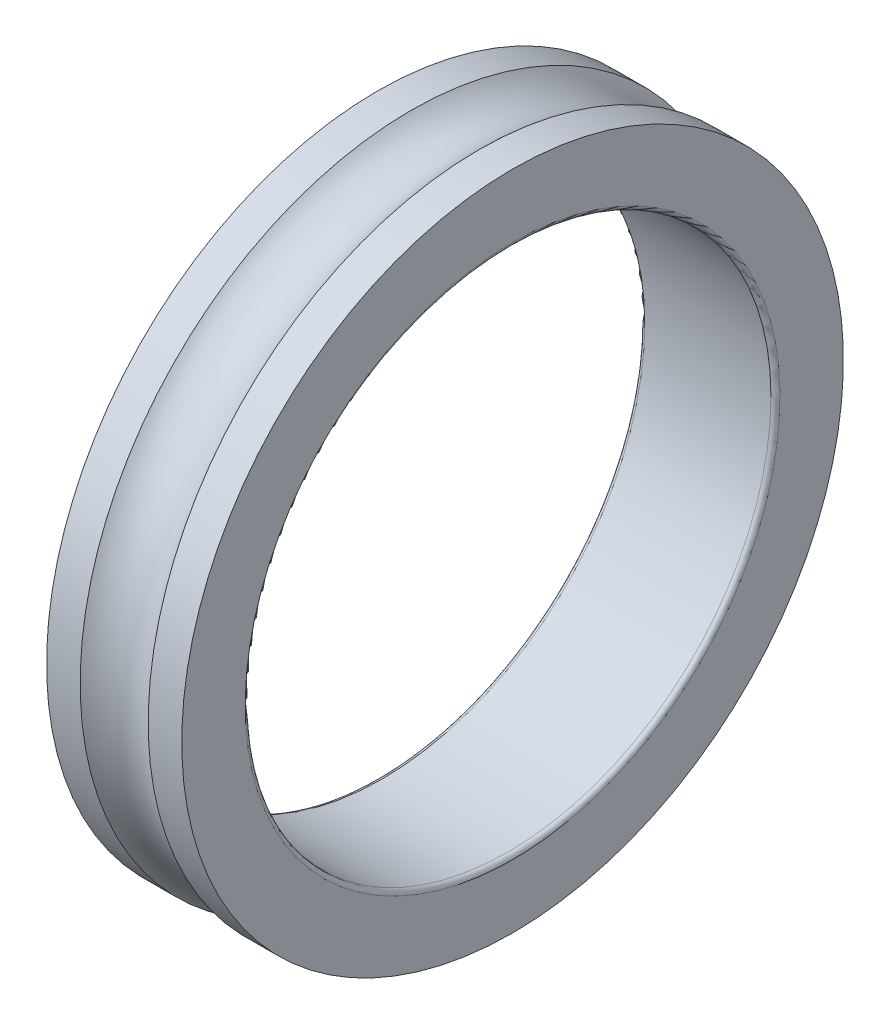
ISO-10303-21;
HEADER;
FILE_DESCRIPTION(('STEP AP214'),'2;1');
FILE_NAME('part.step','',(''),(''),'','','');
FILE_SCHEMA(('AUTOMOTIVE_DESIGN { 1 0 10303 214 1 1 1 1 }'));
ENDSEC;
DATA;
#1=APPLICATION_CONTEXT('core data for automotive mechanical design processes');
#2=APPLICATION_PROTOCOL_DEFINITION('international standard','automotive_design',2000,#1);
#3=PRODUCT_CONTEXT('',#1,'mechanical');
#4=PRODUCT('Part','Part','',(#3));
#5=PRODUCT_RELATED_PRODUCT_CATEGORY('part','',(#4));
#6=PRODUCT_DEFINITION_FORMATION('','',#4);
#7=PRODUCT_DEFINITION_CONTEXT('part definition',#1,'design');
#8=PRODUCT_DEFINITION('design','',#6,#7);
#9=PRODUCT_DEFINITION_SHAPE('','',#8);
#10=(LENGTH_UNIT() NAMED_UNIT(*) SI_UNIT(.MILLI.,.METRE.));
#11=(NAMED_UNIT(*) PLANE_ANGLE_UNIT() SI_UNIT($,.RADIAN.));
#12=(NAMED_UNIT(*) SI_UNIT($,.STERADIAN.) SOLID_ANGLE_UNIT());
#13=UNCERTAINTY_MEASURE_WITH_UNIT(LENGTH_MEASURE(1.E-05),#10,'distance_accuracy_value','');
#14=(GEOMETRIC_REPRESENTATION_CONTEXT(3) GLOBAL_UNCERTAINTY_ASSIGNED_CONTEXT((#13)) GLOBAL_UNIT_ASSIGNED_CONTEXT((#10,
#11,#12)) REPRESENTATION_CONTEXT('',''));
#15=CARTESIAN_POINT('',(0.,0.,0.));
#16=DIRECTION('',(0.,0.,1.));
#17=DIRECTION('',(1.,0.,0.));
#18=AXIS2_PLACEMENT_3D('',#15,#16,#17);
#19=CARTESIAN_POINT('',(7.88247516529061,0.,0.));
#20=DIRECTION('',(-1.,0.,0.));
#21=DIRECTION('',(0.,1.,0.));
#22=AXIS2_PLACEMENT_3D('',#19,#20,#21);
#23=CYLINDRICAL_SURFACE('',#22,22.025);
#24=CARTESIAN_POINT('',(6.76495033058121,0.,0.));
#25=DIRECTION('',(1.,0.,0.));
#26=DIRECTION('',(0.,1.,0.));
#27=AXIS2_PLACEMENT_3D('',#24,#25,#26);
#28=CIRCLE('',#27,22.025);
#29=CARTESIAN_POINT('',(6.76495033058121,22.025,0.));
#30=VERTEX_POINT('',#29);
#31=EDGE_CURVE('E11',#30,#30,#28,.T.);
#32=ORIENTED_EDGE('',*,*,#31,.T.);
#33=EDGE_LOOP('',(#32));
#34=FACE_BOUND('',#33,.T.);
#35=CARTESIAN_POINT('',(9.,0.,0.));
#36=DIRECTION('',(1.,0.,0.));
#37=DIRECTION('',(0.,1.,0.));
#38=AXIS2_PLACEMENT_3D('',#35,#36,#37);
#39=CIRCLE('',#38,22.025);
#40=CARTESIAN_POINT('',(9.,22.025,0.));
#41=VERTEX_POINT('',#40);
#42=EDGE_CURVE('E61',#41,#41,#39,.T.);
#43=ORIENTED_EDGE('',*,*,#42,.F.);
#44=EDGE_LOOP('',(#43));
#45=FACE_BOUND('',#44,.T.);
#46=ADVANCED_FACE('F16',(#34,#45),#23,.T.);
#47=CARTESIAN_POINT('',(4.5,0.,0.));
#48=DIRECTION('',(1.,0.,0.));
#49=DIRECTION('',(0.,0.,-1.));
#50=AXIS2_PLACEMENT_3D('',#47,#48,#49);
#51=TOROIDAL_SURFACE('',#50,24.25,3.175);
#52=CARTESIAN_POINT('',(2.23504966941878,0.,0.));
#53=DIRECTION('',(1.,0.,0.));
#54=DIRECTION('',(0.,1.,0.));
#55=AXIS2_PLACEMENT_3D('',#52,#53,#54);
#56=CIRCLE('',#55,22.025);
#57=CARTESIAN_POINT('',(2.23504966941878,22.025,0.));
#58=VERTEX_POINT('',#57);
#59=EDGE_CURVE('E25',#58,#58,#56,.T.);
#60=ORIENTED_EDGE('',*,*,#59,.T.);
#61=EDGE_LOOP('',(#60));
#62=FACE_BOUND('',#61,.T.);
#63=ORIENTED_EDGE('',*,*,#31,.F.);
#64=EDGE_LOOP('',(#63));
#65=FACE_BOUND('',#64,.T.);
#66=ADVANCED_FACE('F18',(#62,#65),#51,.F.);
#67=CARTESIAN_POINT('',(1.11752483470939,0.,0.));
#68=DIRECTION('',(-1.,0.,0.));
#69=DIRECTION('',(0.,1.,0.));
#70=AXIS2_PLACEMENT_3D('',#67,#68,#69);
#71=CYLINDRICAL_SURFACE('',#70,22.025);
#72=CARTESIAN_POINT('',(0.,0.,0.));
#73=DIRECTION('',(1.,0.,0.));
#74=DIRECTION('',(0.,1.,0.));
#75=AXIS2_PLACEMENT_3D('',#72,#73,#74);
#76=CIRCLE('',#75,22.025);
#77=CARTESIAN_POINT('',(0.,22.025,0.));
#78=VERTEX_POINT('',#77);
#79=EDGE_CURVE('E69',#78,#78,#76,.T.);
#80=ORIENTED_EDGE('',*,*,#79,.T.);
#81=EDGE_LOOP('',(#80));
#82=FACE_BOUND('',#81,.T.);
#83=ORIENTED_EDGE('',*,*,#59,.F.);
#84=EDGE_LOOP('',(#83));
#85=FACE_BOUND('',#84,.T.);
#86=ADVANCED_FACE('F74',(#82,#85),#71,.T.);
#87=CARTESIAN_POINT('',(0.,19.9125,0.));
#88=DIRECTION('',(-1.,0.,0.));
#89=DIRECTION('',(0.,-1.,0.));
#90=AXIS2_PLACEMENT_3D('',#87,#88,#89);
#91=PLANE('',#90);
#92=CARTESIAN_POINT('',(0.,0.,0.));
#93=DIRECTION('',(1.,0.,0.));
#94=DIRECTION('',(0.,1.,0.));
#95=AXIS2_PLACEMENT_3D('',#92,#93,#94);
#96=CIRCLE('',#95,17.8);
#97=CARTESIAN_POINT('',(0.,17.8,0.));
#98=VERTEX_POINT('',#97);
#99=EDGE_CURVE('E50',#98,#98,#96,.T.);
#100=ORIENTED_EDGE('',*,*,#99,.T.);
#101=EDGE_LOOP('',(#100));
#102=FACE_BOUND('',#101,.T.);
#103=ORIENTED_EDGE('',*,*,#79,.F.);
#104=EDGE_LOOP('',(#103));
#105=FACE_BOUND('',#104,.T.);
#106=ADVANCED_FACE('F77',(#102,#105),#91,.T.);
#107=CARTESIAN_POINT('',(0.3,0.,0.));
#108=DIRECTION('',(1.,0.,0.));
#109=DIRECTION('',(0.,0.,-1.));
#110=AXIS2_PLACEMENT_3D('',#107,#108,#109);
#111=TOROIDAL_SURFACE('',#110,17.8,0.3);
#112=CARTESIAN_POINT('',(0.3,0.,0.));
#113=DIRECTION('',(1.,0.,0.));
#114=DIRECTION('',(0.,1.,0.));
#115=AXIS2_PLACEMENT_3D('',#112,#113,#114);
#116=CIRCLE('',#115,17.5);
#117=CARTESIAN_POINT('',(0.3,17.5,0.));
#118=VERTEX_POINT('',#117);
#119=EDGE_CURVE('E54',#118,#118,#116,.T.);
#120=ORIENTED_EDGE('',*,*,#119,.T.);
#121=EDGE_LOOP('',(#120));
#122=FACE_BOUND('',#121,.T.);
#123=ORIENTED_EDGE('',*,*,#99,.F.);
#124=EDGE_LOOP('',(#123));
#125=FACE_BOUND('',#124,.T.);
#126=ADVANCED_FACE('F79',(#122,#125),#111,.T.);
#127=CARTESIAN_POINT('',(4.5,0.,0.));
#128=DIRECTION('',(-1.,0.,0.));
#129=DIRECTION('',(0.,1.,0.));
#130=AXIS2_PLACEMENT_3D('',#127,#128,#129);
#131=CYLINDRICAL_SURFACE('',#130,17.5);
#132=CARTESIAN_POINT('',(8.7,0.,0.));
#133=DIRECTION('',(1.,0.,0.));
#134=DIRECTION('',(0.,1.,0.));
#135=AXIS2_PLACEMENT_3D('',#132,#133,#134);
#136=CIRCLE('',#135,17.5);
#137=CARTESIAN_POINT('',(8.7,17.5,0.));
#138=VERTEX_POINT('',#137);
#139=EDGE_CURVE('E20',#138,#138,#136,.T.);
#140=ORIENTED_EDGE('',*,*,#139,.T.);
#141=EDGE_LOOP('',(#140));
#142=FACE_BOUND('',#141,.T.);
#143=ORIENTED_EDGE('',*,*,#119,.F.);
#144=EDGE_LOOP('',(#143));
#145=FACE_BOUND('',#144,.T.);
#146=ADVANCED_FACE('F58',(#142,#145),#131,.F.);
#147=CARTESIAN_POINT('',(8.7,0.,0.));
#148=DIRECTION('',(1.,0.,0.));
#149=DIRECTION('',(0.,0.,-1.));
#150=AXIS2_PLACEMENT_3D('',#147,#148,#149);
#151=TOROIDAL_SURFACE('',#150,17.8,0.3);
#152=CARTESIAN_POINT('',(9.,0.,0.));
#153=DIRECTION('',(1.,0.,0.));
#154=DIRECTION('',(0.,1.,0.));
#155=AXIS2_PLACEMENT_3D('',#152,#153,#154);
#156=CIRCLE('',#155,17.8);
#157=CARTESIAN_POINT('',(9.,17.8,0.));
#158=VERTEX_POINT('',#157);
#159=EDGE_CURVE('E63',#158,#158,#156,.T.);
#160=ORIENTED_EDGE('',*,*,#159,.T.);
#161=EDGE_LOOP('',(#160));
#162=FACE_BOUND('',#161,.T.);
#163=ORIENTED_EDGE('',*,*,#139,.F.);
#164=EDGE_LOOP('',(#163));
#165=FACE_BOUND('',#164,.T.);
#166=ADVANCED_FACE('F97',(#162,#165),#151,.T.);
#167=CARTESIAN_POINT('',(9.,19.9125,0.));
#168=DIRECTION('',(1.,0.,0.));
#169=DIRECTION('',(0.,1.,0.));
#170=AXIS2_PLACEMENT_3D('',#167,#168,#169);
#171=PLANE('',#170);
#172=ORIENTED_EDGE('',*,*,#42,.T.);
#173=EDGE_LOOP('',(#172));
#174=FACE_BOUND('',#173,.T.);
#175=ORIENTED_EDGE('',*,*,#159,.F.);
#176=EDGE_LOOP('',(#175));
#177=FACE_BOUND('',#176,.T.);
#178=ADVANCED_FACE('F95',(#174,#177),#171,.T.);
#179=CLOSED_SHELL('',(#46,#66,#86,#106,#126,#146,#166,#178));
#180=MANIFOLD_SOLID_BREP('B1',#179);
#181=ADVANCED_BREP_SHAPE_REPRESENTATION('',(#18,#180),#14);
#182=SHAPE_DEFINITION_REPRESENTATION(#9,#181);
ENDSEC;
END-ISO-10303-21;
